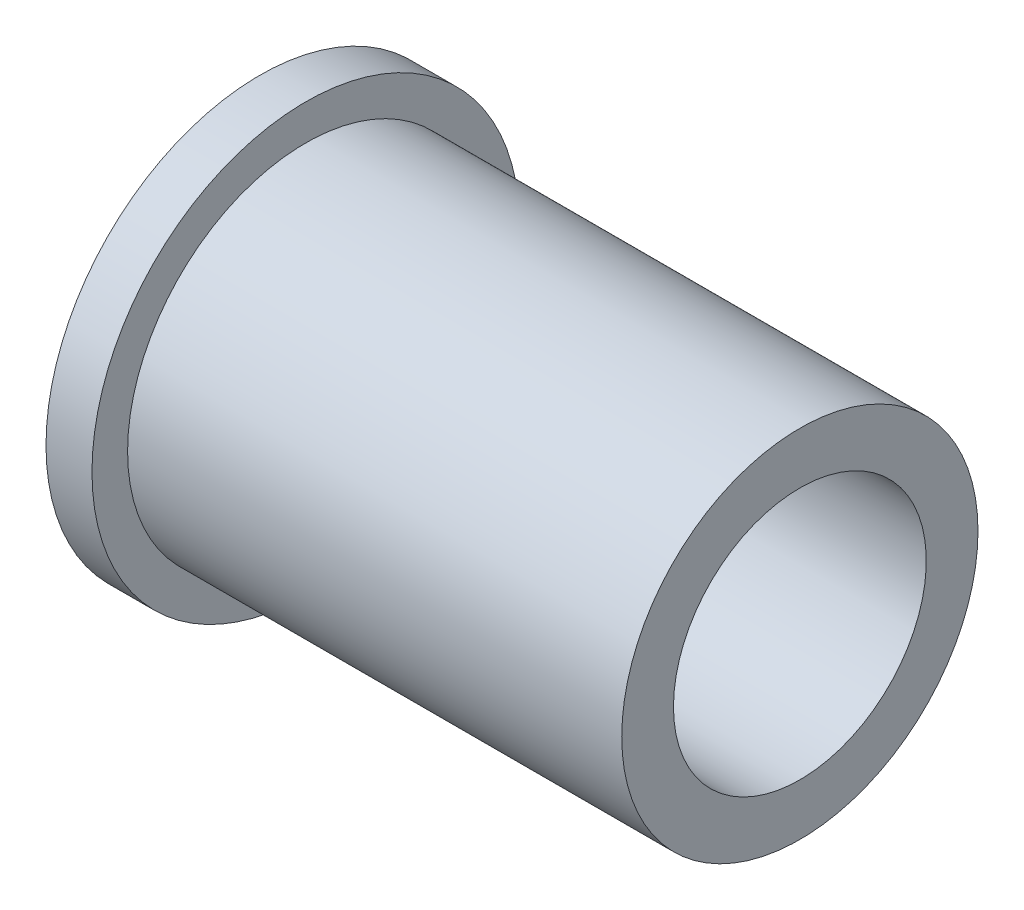
ISO-10303-21;
HEADER;
FILE_DESCRIPTION(('STEP AP214'),'2;1');
FILE_NAME('part.step','',(''),(''),'','','');
FILE_SCHEMA(('AUTOMOTIVE_DESIGN { 1 0 10303 214 1 1 1 1 }'));
ENDSEC;
DATA;
#1=APPLICATION_CONTEXT('core data for automotive mechanical design processes');
#2=APPLICATION_PROTOCOL_DEFINITION('international standard','automotive_design',2000,#1);
#3=PRODUCT_CONTEXT('',#1,'mechanical');
#4=PRODUCT('Part','Part','',(#3));
#5=PRODUCT_RELATED_PRODUCT_CATEGORY('part','',(#4));
#6=PRODUCT_DEFINITION_FORMATION('','',#4);
#7=PRODUCT_DEFINITION_CONTEXT('part definition',#1,'design');
#8=PRODUCT_DEFINITION('design','',#6,#7);
#9=PRODUCT_DEFINITION_SHAPE('','',#8);
#10=(LENGTH_UNIT() NAMED_UNIT(*) SI_UNIT(.MILLI.,.METRE.));
#11=(NAMED_UNIT(*) PLANE_ANGLE_UNIT() SI_UNIT($,.RADIAN.));
#12=(NAMED_UNIT(*) SI_UNIT($,.STERADIAN.) SOLID_ANGLE_UNIT());
#13=UNCERTAINTY_MEASURE_WITH_UNIT(LENGTH_MEASURE(1.E-05),#10,'distance_accuracy_value','');
#14=(GEOMETRIC_REPRESENTATION_CONTEXT(3) GLOBAL_UNCERTAINTY_ASSIGNED_CONTEXT((#13)) GLOBAL_UNIT_ASSIGNED_CONTEXT((#10,
#11,#12)) REPRESENTATION_CONTEXT('',''));
#15=CARTESIAN_POINT('',(0.,0.,0.));
#16=DIRECTION('',(0.,0.,1.));
#17=DIRECTION('',(1.,0.,0.));
#18=AXIS2_PLACEMENT_3D('',#15,#16,#17);
#19=CARTESIAN_POINT('',(0.,0.,0.));
#20=DIRECTION('',(-1.,0.,0.));
#21=DIRECTION('',(0.,0.,1.));
#22=AXIS2_PLACEMENT_3D('',#19,#20,#21);
#23=CYLINDRICAL_SURFACE('',#22,18.6);
#24=CARTESIAN_POINT('',(0.,0.,0.));
#25=DIRECTION('',(-1.,0.,0.));
#26=DIRECTION('',(0.,0.,1.));
#27=AXIS2_PLACEMENT_3D('',#24,#25,#26);
#28=CIRCLE('',#27,18.6);
#29=CARTESIAN_POINT('',(0.,0.,18.6));
#30=VERTEX_POINT('',#29);
#31=EDGE_CURVE('E52',#30,#30,#28,.T.);
#32=ORIENTED_EDGE('',*,*,#31,.F.);
#33=EDGE_LOOP('',(#32));
#34=FACE_BOUND('',#33,.T.);
#35=CARTESIAN_POINT('',(4.,0.,0.));
#36=DIRECTION('',(-1.,0.,0.));
#37=DIRECTION('',(0.,0.,1.));
#38=AXIS2_PLACEMENT_3D('',#35,#36,#37);
#39=CIRCLE('',#38,18.6);
#40=CARTESIAN_POINT('',(4.,0.,18.6));
#41=VERTEX_POINT('',#40);
#42=EDGE_CURVE('E10',#41,#41,#39,.T.);
#43=ORIENTED_EDGE('',*,*,#42,.T.);
#44=EDGE_LOOP('',(#43));
#45=FACE_BOUND('',#44,.T.);
#46=ADVANCED_FACE('F30',(#34,#45),#23,.T.);
#47=CARTESIAN_POINT('',(4.,15.5,0.));
#48=DIRECTION('',(-1.,0.,0.));
#49=DIRECTION('',(0.,0.,1.));
#50=AXIS2_PLACEMENT_3D('',#47,#48,#49);
#51=PLANE('',#50);
#52=ORIENTED_EDGE('',*,*,#42,.F.);
#53=EDGE_LOOP('',(#52));
#54=FACE_BOUND('',#53,.T.);
#55=CARTESIAN_POINT('',(4.,0.,0.));
#56=DIRECTION('',(-1.,0.,0.));
#57=DIRECTION('',(0.,0.,1.));
#58=AXIS2_PLACEMENT_3D('',#55,#56,#57);
#59=CIRCLE('',#58,15.5);
#60=CARTESIAN_POINT('',(4.,0.,15.5));
#61=VERTEX_POINT('',#60);
#62=EDGE_CURVE('E36',#61,#61,#59,.T.);
#63=ORIENTED_EDGE('',*,*,#62,.T.);
#64=EDGE_LOOP('',(#63));
#65=FACE_BOUND('',#64,.T.);
#66=ADVANCED_FACE('F59',(#54,#65),#51,.F.);
#67=CARTESIAN_POINT('',(0.,0.,0.));
#68=DIRECTION('',(-1.,0.,0.));
#69=DIRECTION('',(0.,0.,1.));
#70=AXIS2_PLACEMENT_3D('',#67,#68,#69);
#71=CYLINDRICAL_SURFACE('',#70,15.5);
#72=ORIENTED_EDGE('',*,*,#62,.F.);
#73=EDGE_LOOP('',(#72));
#74=FACE_BOUND('',#73,.T.);
#75=CARTESIAN_POINT('',(47.,0.,0.));
#76=DIRECTION('',(-1.,0.,0.));
#77=DIRECTION('',(0.,0.,1.));
#78=AXIS2_PLACEMENT_3D('',#75,#76,#77);
#79=CIRCLE('',#78,15.5);
#80=CARTESIAN_POINT('',(47.,0.,15.5));
#81=VERTEX_POINT('',#80);
#82=EDGE_CURVE('E40',#81,#81,#79,.T.);
#83=ORIENTED_EDGE('',*,*,#82,.T.);
#84=EDGE_LOOP('',(#83));
#85=FACE_BOUND('',#84,.T.);
#86=ADVANCED_FACE('F63',(#74,#85),#71,.T.);
#87=CARTESIAN_POINT('',(47.,11.,0.));
#88=DIRECTION('',(-1.,0.,0.));
#89=DIRECTION('',(0.,0.,1.));
#90=AXIS2_PLACEMENT_3D('',#87,#88,#89);
#91=PLANE('',#90);
#92=ORIENTED_EDGE('',*,*,#82,.F.);
#93=EDGE_LOOP('',(#92));
#94=FACE_BOUND('',#93,.T.);
#95=CARTESIAN_POINT('',(47.,0.,0.));
#96=DIRECTION('',(-1.,0.,0.));
#97=DIRECTION('',(0.,0.,1.));
#98=AXIS2_PLACEMENT_3D('',#95,#96,#97);
#99=CIRCLE('',#98,11.);
#100=CARTESIAN_POINT('',(47.,0.,11.));
#101=VERTEX_POINT('',#100);
#102=EDGE_CURVE('E44',#101,#101,#99,.T.);
#103=ORIENTED_EDGE('',*,*,#102,.T.);
#104=EDGE_LOOP('',(#103));
#105=FACE_BOUND('',#104,.T.);
#106=ADVANCED_FACE('F68',(#94,#105),#91,.F.);
#107=CARTESIAN_POINT('',(0.,0.,0.));
#108=DIRECTION('',(-1.,0.,0.));
#109=DIRECTION('',(0.,0.,1.));
#110=AXIS2_PLACEMENT_3D('',#107,#108,#109);
#111=CYLINDRICAL_SURFACE('',#110,11.);
#112=ORIENTED_EDGE('',*,*,#102,.F.);
#113=EDGE_LOOP('',(#112));
#114=FACE_BOUND('',#113,.T.);
#115=CARTESIAN_POINT('',(0.,0.,0.));
#116=DIRECTION('',(-1.,0.,0.));
#117=DIRECTION('',(0.,0.,1.));
#118=AXIS2_PLACEMENT_3D('',#115,#116,#117);
#119=CIRCLE('',#118,11.);
#120=CARTESIAN_POINT('',(0.,0.,11.));
#121=VERTEX_POINT('',#120);
#122=EDGE_CURVE('E49',#121,#121,#119,.T.);
#123=ORIENTED_EDGE('',*,*,#122,.T.);
#124=EDGE_LOOP('',(#123));
#125=FACE_BOUND('',#124,.T.);
#126=ADVANCED_FACE('F74',(#114,#125),#111,.F.);
#127=CARTESIAN_POINT('',(0.,18.6,0.));
#128=DIRECTION('',(1.,0.,0.));
#129=DIRECTION('',(0.,0.,-1.));
#130=AXIS2_PLACEMENT_3D('',#127,#128,#129);
#131=PLANE('',#130);
#132=ORIENTED_EDGE('',*,*,#122,.F.);
#133=EDGE_LOOP('',(#132));
#134=FACE_BOUND('',#133,.T.);
#135=ORIENTED_EDGE('',*,*,#31,.T.);
#136=EDGE_LOOP('',(#135));
#137=FACE_BOUND('',#136,.T.);
#138=ADVANCED_FACE('F56',(#134,#137),#131,.F.);
#139=CLOSED_SHELL('',(#46,#66,#86,#106,#126,#138));
#140=MANIFOLD_SOLID_BREP('B2',#139);
#141=ADVANCED_BREP_SHAPE_REPRESENTATION('',(#18,#140),#14);
#142=SHAPE_DEFINITION_REPRESENTATION(#9,#141);
ENDSEC;
END-ISO-10303-21;
